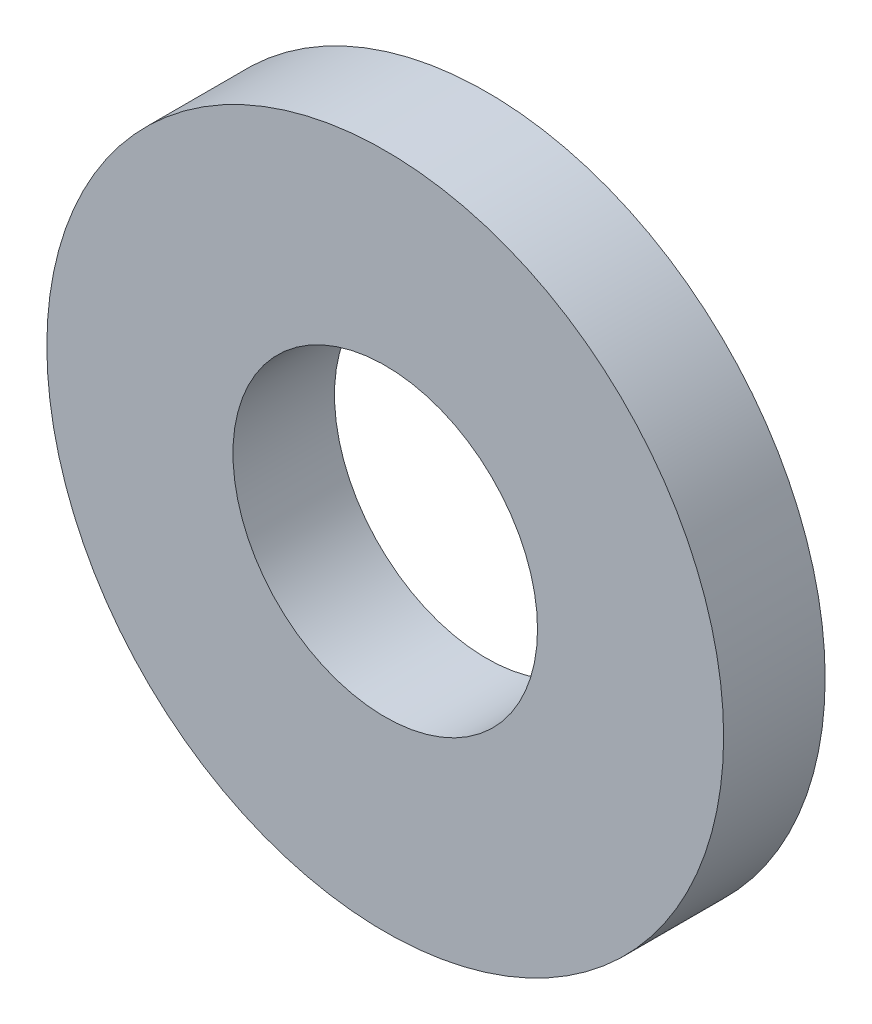
ISO-10303-21;
HEADER;
FILE_DESCRIPTION(('STEP AP214'),'2;1');
FILE_NAME('part.step','',(''),(''),'','','');
FILE_SCHEMA(('AUTOMOTIVE_DESIGN { 1 0 10303 214 1 1 1 1 }'));
ENDSEC;
DATA;
#1=APPLICATION_CONTEXT('core data for automotive mechanical design processes');
#2=APPLICATION_PROTOCOL_DEFINITION('international standard','automotive_design',2000,#1);
#3=PRODUCT_CONTEXT('',#1,'mechanical');
#4=PRODUCT('Part','Part','',(#3));
#5=PRODUCT_RELATED_PRODUCT_CATEGORY('part','',(#4));
#6=PRODUCT_DEFINITION_FORMATION('','',#4);
#7=PRODUCT_DEFINITION_CONTEXT('part definition',#1,'design');
#8=PRODUCT_DEFINITION('design','',#6,#7);
#9=PRODUCT_DEFINITION_SHAPE('','',#8);
#10=(LENGTH_UNIT() NAMED_UNIT(*) SI_UNIT(.MILLI.,.METRE.));
#11=(NAMED_UNIT(*) PLANE_ANGLE_UNIT() SI_UNIT($,.RADIAN.));
#12=(NAMED_UNIT(*) SI_UNIT($,.STERADIAN.) SOLID_ANGLE_UNIT());
#13=UNCERTAINTY_MEASURE_WITH_UNIT(LENGTH_MEASURE(1.E-05),#10,'distance_accuracy_value','');
#14=(GEOMETRIC_REPRESENTATION_CONTEXT(3) GLOBAL_UNCERTAINTY_ASSIGNED_CONTEXT((#13)) GLOBAL_UNIT_ASSIGNED_CONTEXT((#10,
#11,#12)) REPRESENTATION_CONTEXT('',''));
#15=CARTESIAN_POINT('',(0.,0.,0.));
#16=DIRECTION('',(0.,0.,1.));
#17=DIRECTION('',(1.,0.,0.));
#18=AXIS2_PLACEMENT_3D('',#15,#16,#17);
#19=CARTESIAN_POINT('',(0.,0.,3.));
#20=DIRECTION('',(0.,0.,1.));
#21=DIRECTION('',(1.,0.,0.));
#22=AXIS2_PLACEMENT_3D('',#19,#20,#21);
#23=PLANE('',#22);
#24=CARTESIAN_POINT('',(0.,0.,3.));
#25=DIRECTION('',(0.,0.,1.));
#26=DIRECTION('',(1.,0.,0.));
#27=AXIS2_PLACEMENT_3D('',#24,#25,#26);
#28=CIRCLE('',#27,10.);
#29=CARTESIAN_POINT('',(10.,0.,3.));
#30=VERTEX_POINT('',#29);
#31=EDGE_CURVE('E10',#30,#30,#28,.T.);
#32=ORIENTED_EDGE('',*,*,#31,.T.);
#33=EDGE_LOOP('',(#32));
#34=FACE_BOUND('',#33,.T.);
#35=CARTESIAN_POINT('',(0.,0.,3.));
#36=DIRECTION('',(0.,0.,1.));
#37=DIRECTION('',(1.,0.,0.));
#38=AXIS2_PLACEMENT_3D('',#35,#36,#37);
#39=CIRCLE('',#38,4.5);
#40=CARTESIAN_POINT('',(4.5,0.,3.));
#41=VERTEX_POINT('',#40);
#42=EDGE_CURVE('E43',#41,#41,#39,.T.);
#43=ORIENTED_EDGE('',*,*,#42,.F.);
#44=EDGE_LOOP('',(#43));
#45=FACE_BOUND('',#44,.T.);
#46=ADVANCED_FACE('F32',(#34,#45),#23,.T.);
#47=CARTESIAN_POINT('',(0.,0.,0.));
#48=DIRECTION('',(0.,0.,1.));
#49=DIRECTION('',(1.,0.,0.));
#50=AXIS2_PLACEMENT_3D('',#47,#48,#49);
#51=PLANE('',#50);
#52=CARTESIAN_POINT('',(0.,0.,0.));
#53=DIRECTION('',(0.,0.,1.));
#54=DIRECTION('',(1.,0.,0.));
#55=AXIS2_PLACEMENT_3D('',#52,#53,#54);
#56=CIRCLE('',#55,10.);
#57=CARTESIAN_POINT('',(10.,0.,0.));
#58=VERTEX_POINT('',#57);
#59=EDGE_CURVE('E36',#58,#58,#56,.T.);
#60=ORIENTED_EDGE('',*,*,#59,.F.);
#61=EDGE_LOOP('',(#60));
#62=FACE_BOUND('',#61,.T.);
#63=CARTESIAN_POINT('',(0.,0.,0.));
#64=DIRECTION('',(0.,0.,1.));
#65=DIRECTION('',(1.,0.,0.));
#66=AXIS2_PLACEMENT_3D('',#63,#64,#65);
#67=CIRCLE('',#66,4.5);
#68=CARTESIAN_POINT('',(4.5,0.,0.));
#69=VERTEX_POINT('',#68);
#70=EDGE_CURVE('E45',#69,#69,#67,.T.);
#71=ORIENTED_EDGE('',*,*,#70,.T.);
#72=EDGE_LOOP('',(#71));
#73=FACE_BOUND('',#72,.T.);
#74=ADVANCED_FACE('F55',(#62,#73),#51,.F.);
#75=CARTESIAN_POINT('',(0.,0.,3.));
#76=DIRECTION('',(0.,0.,-1.));
#77=DIRECTION('',(-1.,0.,0.));
#78=AXIS2_PLACEMENT_3D('',#75,#76,#77);
#79=CYLINDRICAL_SURFACE('',#78,10.);
#80=ORIENTED_EDGE('',*,*,#31,.F.);
#81=EDGE_LOOP('',(#80));
#82=FACE_BOUND('',#81,.T.);
#83=ORIENTED_EDGE('',*,*,#59,.T.);
#84=EDGE_LOOP('',(#83));
#85=FACE_BOUND('',#84,.T.);
#86=ADVANCED_FACE('F34',(#82,#85),#79,.T.);
#87=CARTESIAN_POINT('',(0.,0.,3.));
#88=DIRECTION('',(0.,0.,-1.));
#89=DIRECTION('',(-1.,0.,0.));
#90=AXIS2_PLACEMENT_3D('',#87,#88,#89);
#91=CYLINDRICAL_SURFACE('',#90,4.5);
#92=ORIENTED_EDGE('',*,*,#42,.T.);
#93=EDGE_LOOP('',(#92));
#94=FACE_BOUND('',#93,.T.);
#95=ORIENTED_EDGE('',*,*,#70,.F.);
#96=EDGE_LOOP('',(#95));
#97=FACE_BOUND('',#96,.T.);
#98=ADVANCED_FACE('F51',(#94,#97),#91,.F.);
#99=CLOSED_SHELL('',(#46,#74,#86,#98));
#100=MANIFOLD_SOLID_BREP('B2',#99);
#101=ADVANCED_BREP_SHAPE_REPRESENTATION('',(#18,#100),#14);
#102=SHAPE_DEFINITION_REPRESENTATION(#9,#101);
ENDSEC;
END-ISO-10303-21;
